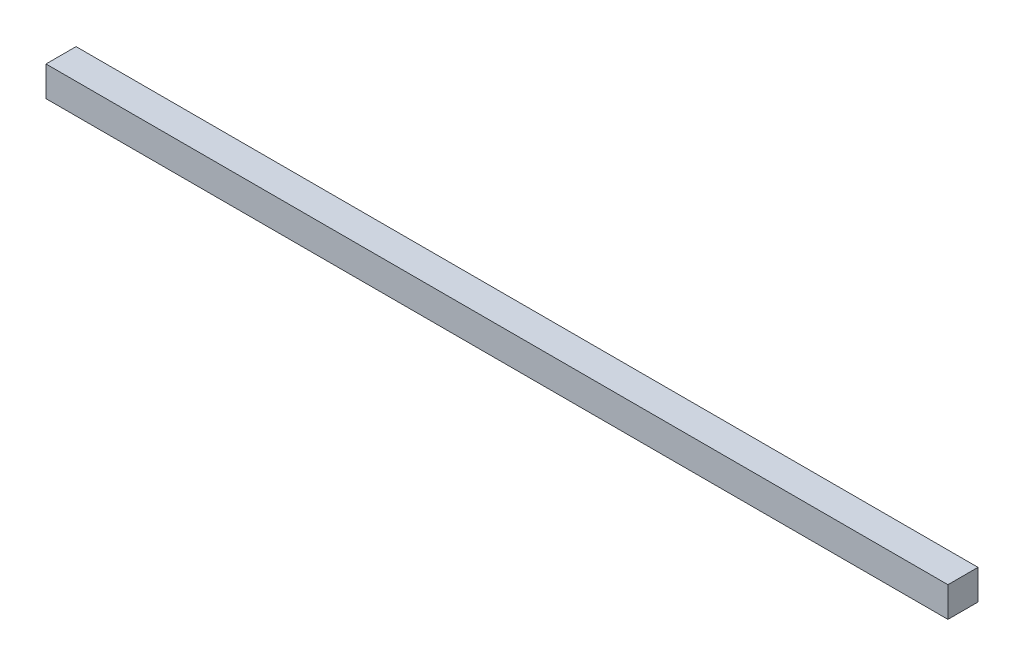
ISO-10303-21;
HEADER;
FILE_DESCRIPTION(('STEP AP214'),'2;1');
FILE_NAME('part.step','',(''),(''),'','','');
FILE_SCHEMA(('AUTOMOTIVE_DESIGN { 1 0 10303 214 1 1 1 1 }'));
ENDSEC;
DATA;
#1=APPLICATION_CONTEXT('core data for automotive mechanical design processes');
#2=APPLICATION_PROTOCOL_DEFINITION('international standard','automotive_design',2000,#1);
#3=PRODUCT_CONTEXT('',#1,'mechanical');
#4=PRODUCT('Part','Part','',(#3));
#5=PRODUCT_RELATED_PRODUCT_CATEGORY('part','',(#4));
#6=PRODUCT_DEFINITION_FORMATION('','',#4);
#7=PRODUCT_DEFINITION_CONTEXT('part definition',#1,'design');
#8=PRODUCT_DEFINITION('design','',#6,#7);
#9=PRODUCT_DEFINITION_SHAPE('','',#8);
#10=(LENGTH_UNIT() NAMED_UNIT(*) SI_UNIT(.MILLI.,.METRE.));
#11=(NAMED_UNIT(*) PLANE_ANGLE_UNIT() SI_UNIT($,.RADIAN.));
#12=(NAMED_UNIT(*) SI_UNIT($,.STERADIAN.) SOLID_ANGLE_UNIT());
#13=UNCERTAINTY_MEASURE_WITH_UNIT(LENGTH_MEASURE(1.E-05),#10,'distance_accuracy_value','');
#14=(GEOMETRIC_REPRESENTATION_CONTEXT(3) GLOBAL_UNCERTAINTY_ASSIGNED_CONTEXT((#13)) GLOBAL_UNIT_ASSIGNED_CONTEXT((#10,
#11,#12)) REPRESENTATION_CONTEXT('',''));
#15=CARTESIAN_POINT('',(0.,0.,0.));
#16=DIRECTION('',(0.,0.,1.));
#17=DIRECTION('',(1.,0.,0.));
#18=AXIS2_PLACEMENT_3D('',#15,#16,#17);
#19=CARTESIAN_POINT('',(-202.005226480836,12.7,12.7));
#20=DIRECTION('',(1.,0.,0.));
#21=DIRECTION('',(0.,0.,-1.));
#22=AXIS2_PLACEMENT_3D('',#19,#20,#21);
#23=PLANE('',#22);
#24=DIRECTION('',(0.,-1.,0.));
#25=VECTOR('',#24,1.);
#26=CARTESIAN_POINT('',(-202.005226480836,12.7,0.));
#27=LINE('',#26,#25);
#28=CARTESIAN_POINT('',(-202.005226480836,12.7,0.));
#29=VERTEX_POINT('',#28);
#30=CARTESIAN_POINT('',(-202.005226480836,0.,0.));
#31=VERTEX_POINT('',#30);
#32=EDGE_CURVE('E96',#29,#31,#27,.T.);
#33=ORIENTED_EDGE('',*,*,#32,.T.);
#34=DIRECTION('',(0.,0.,-1.));
#35=VECTOR('',#34,1.);
#36=CARTESIAN_POINT('',(-202.005226480836,0.,12.7));
#37=LINE('',#36,#35);
#38=CARTESIAN_POINT('',(-202.005226480836,0.,12.7));
#39=VERTEX_POINT('',#38);
#40=EDGE_CURVE('E11',#39,#31,#37,.T.);
#41=ORIENTED_EDGE('',*,*,#40,.F.);
#42=DIRECTION('',(0.,-1.,0.));
#43=VECTOR('',#42,1.);
#44=CARTESIAN_POINT('',(-202.005226480836,12.7,12.7));
#45=LINE('',#44,#43);
#46=CARTESIAN_POINT('',(-202.005226480836,12.7,12.7));
#47=VERTEX_POINT('',#46);
#48=EDGE_CURVE('E84',#47,#39,#45,.T.);
#49=ORIENTED_EDGE('',*,*,#48,.F.);
#50=DIRECTION('',(0.,0.,-1.));
#51=VECTOR('',#50,1.);
#52=CARTESIAN_POINT('',(-202.005226480836,12.7,12.7));
#53=LINE('',#52,#51);
#54=EDGE_CURVE('E92',#47,#29,#53,.T.);
#55=ORIENTED_EDGE('',*,*,#54,.T.);
#56=EDGE_LOOP('',(#33,#41,#49,#55));
#57=FACE_BOUND('',#56,.T.);
#58=ADVANCED_FACE('F33',(#57),#23,.F.);
#59=CARTESIAN_POINT('',(-202.005226480836,0.,12.7));
#60=DIRECTION('',(0.,1.,0.));
#61=DIRECTION('',(0.,0.,1.));
#62=AXIS2_PLACEMENT_3D('',#59,#60,#61);
#63=PLANE('',#62);
#64=DIRECTION('',(1.,0.,0.));
#65=VECTOR('',#64,1.);
#66=CARTESIAN_POINT('',(-202.005226480836,0.,0.));
#67=LINE('',#66,#65);
#68=CARTESIAN_POINT('',(178.994773519164,0.,0.));
#69=VERTEX_POINT('',#68);
#70=EDGE_CURVE('E88',#31,#69,#67,.T.);
#71=ORIENTED_EDGE('',*,*,#70,.T.);
#72=DIRECTION('',(0.,0.,-1.));
#73=VECTOR('',#72,1.);
#74=CARTESIAN_POINT('',(178.994773519164,0.,12.7));
#75=LINE('',#74,#73);
#76=CARTESIAN_POINT('',(178.994773519164,0.,12.7));
#77=VERTEX_POINT('',#76);
#78=EDGE_CURVE('E41',#77,#69,#75,.T.);
#79=ORIENTED_EDGE('',*,*,#78,.F.);
#80=DIRECTION('',(1.,0.,0.));
#81=VECTOR('',#80,1.);
#82=CARTESIAN_POINT('',(-202.005226480836,0.,12.7));
#83=LINE('',#82,#81);
#84=EDGE_CURVE('E79',#39,#77,#83,.T.);
#85=ORIENTED_EDGE('',*,*,#84,.F.);
#86=ORIENTED_EDGE('',*,*,#40,.T.);
#87=EDGE_LOOP('',(#71,#79,#85,#86));
#88=FACE_BOUND('',#87,.T.);
#89=ADVANCED_FACE('F87',(#88),#63,.F.);
#90=CARTESIAN_POINT('',(178.994773519164,0.,12.7));
#91=DIRECTION('',(-1.,0.,0.));
#92=DIRECTION('',(0.,0.,1.));
#93=AXIS2_PLACEMENT_3D('',#90,#91,#92);
#94=PLANE('',#93);
#95=DIRECTION('',(0.,1.,0.));
#96=VECTOR('',#95,1.);
#97=CARTESIAN_POINT('',(178.994773519164,0.,0.));
#98=LINE('',#97,#96);
#99=CARTESIAN_POINT('',(178.994773519164,12.7,0.));
#100=VERTEX_POINT('',#99);
#101=EDGE_CURVE('E66',#69,#100,#98,.T.);
#102=ORIENTED_EDGE('',*,*,#101,.T.);
#103=DIRECTION('',(0.,0.,-1.));
#104=VECTOR('',#103,1.);
#105=CARTESIAN_POINT('',(178.994773519164,12.7,12.7));
#106=LINE('',#105,#104);
#107=CARTESIAN_POINT('',(178.994773519164,12.7,12.7));
#108=VERTEX_POINT('',#107);
#109=EDGE_CURVE('E89',#108,#100,#106,.T.);
#110=ORIENTED_EDGE('',*,*,#109,.F.);
#111=DIRECTION('',(0.,1.,0.));
#112=VECTOR('',#111,1.);
#113=CARTESIAN_POINT('',(178.994773519164,0.,12.7));
#114=LINE('',#113,#112);
#115=EDGE_CURVE('E82',#77,#108,#114,.T.);
#116=ORIENTED_EDGE('',*,*,#115,.F.);
#117=ORIENTED_EDGE('',*,*,#78,.T.);
#118=EDGE_LOOP('',(#102,#110,#116,#117));
#119=FACE_BOUND('',#118,.T.);
#120=ADVANCED_FACE('F90',(#119),#94,.F.);
#121=CARTESIAN_POINT('',(178.994773519164,12.7,12.7));
#122=DIRECTION('',(0.,-1.,0.));
#123=DIRECTION('',(1.,0.,0.));
#124=AXIS2_PLACEMENT_3D('',#121,#122,#123);
#125=PLANE('',#124);
#126=DIRECTION('',(-1.,0.,0.));
#127=VECTOR('',#126,1.);
#128=CARTESIAN_POINT('',(178.994773519164,12.7,0.));
#129=LINE('',#128,#127);
#130=EDGE_CURVE('E72',#100,#29,#129,.T.);
#131=ORIENTED_EDGE('',*,*,#130,.T.);
#132=ORIENTED_EDGE('',*,*,#54,.F.);
#133=DIRECTION('',(-1.,0.,0.));
#134=VECTOR('',#133,1.);
#135=CARTESIAN_POINT('',(178.994773519164,12.7,12.7));
#136=LINE('',#135,#134);
#137=EDGE_CURVE('E49',#108,#47,#136,.T.);
#138=ORIENTED_EDGE('',*,*,#137,.F.);
#139=ORIENTED_EDGE('',*,*,#109,.T.);
#140=EDGE_LOOP('',(#131,#132,#138,#139));
#141=FACE_BOUND('',#140,.T.);
#142=ADVANCED_FACE('F103',(#141),#125,.F.);
#143=CARTESIAN_POINT('',(0.,0.,12.7));
#144=DIRECTION('',(0.,0.,1.));
#145=DIRECTION('',(1.,0.,0.));
#146=AXIS2_PLACEMENT_3D('',#143,#144,#145);
#147=PLANE('',#146);
#148=ORIENTED_EDGE('',*,*,#48,.T.);
#149=ORIENTED_EDGE('',*,*,#84,.T.);
#150=ORIENTED_EDGE('',*,*,#115,.T.);
#151=ORIENTED_EDGE('',*,*,#137,.T.);
#152=EDGE_LOOP('',(#148,#149,#150,#151));
#153=FACE_BOUND('',#152,.T.);
#154=ADVANCED_FACE('F80',(#153),#147,.T.);
#155=CARTESIAN_POINT('',(0.,0.,0.));
#156=DIRECTION('',(0.,0.,1.));
#157=DIRECTION('',(1.,0.,0.));
#158=AXIS2_PLACEMENT_3D('',#155,#156,#157);
#159=PLANE('',#158);
#160=ORIENTED_EDGE('',*,*,#32,.F.);
#161=ORIENTED_EDGE('',*,*,#130,.F.);
#162=ORIENTED_EDGE('',*,*,#101,.F.);
#163=ORIENTED_EDGE('',*,*,#70,.F.);
#164=EDGE_LOOP('',(#160,#161,#162,#163));
#165=FACE_BOUND('',#164,.T.);
#166=ADVANCED_FACE('F106',(#165),#159,.F.);
#167=CLOSED_SHELL('',(#58,#89,#120,#142,#154,#166));
#168=MANIFOLD_SOLID_BREP('B2',#167);
#169=ADVANCED_BREP_SHAPE_REPRESENTATION('',(#18,#168),#14);
#170=SHAPE_DEFINITION_REPRESENTATION(#9,#169);
ENDSEC;
END-ISO-10303-21;
